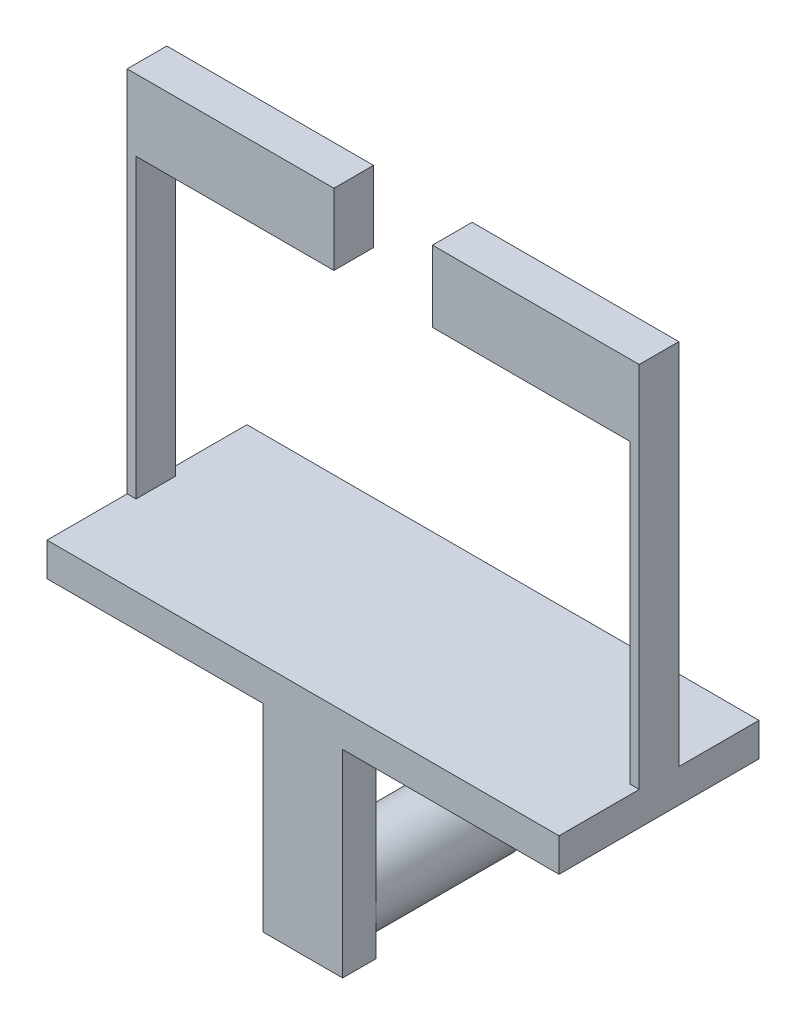
ISO-10303-21;
HEADER;
FILE_DESCRIPTION(('STEP AP214'),'2;1');
FILE_NAME('part.step','',(''),(''),'','','');
FILE_SCHEMA(('AUTOMOTIVE_DESIGN { 1 0 10303 214 1 1 1 1 }'));
ENDSEC;
DATA;
#1=APPLICATION_CONTEXT('core data for automotive mechanical design processes');
#2=APPLICATION_PROTOCOL_DEFINITION('international standard','automotive_design',2000,#1);
#3=PRODUCT_CONTEXT('',#1,'mechanical');
#4=PRODUCT('Part','Part','',(#3));
#5=PRODUCT_RELATED_PRODUCT_CATEGORY('part','',(#4));
#6=PRODUCT_DEFINITION_FORMATION('','',#4);
#7=PRODUCT_DEFINITION_CONTEXT('part definition',#1,'design');
#8=PRODUCT_DEFINITION('design','',#6,#7);
#9=PRODUCT_DEFINITION_SHAPE('','',#8);
#10=(LENGTH_UNIT() NAMED_UNIT(*) SI_UNIT(.MILLI.,.METRE.));
#11=(NAMED_UNIT(*) PLANE_ANGLE_UNIT() SI_UNIT($,.RADIAN.));
#12=(NAMED_UNIT(*) SI_UNIT($,.STERADIAN.) SOLID_ANGLE_UNIT());
#13=UNCERTAINTY_MEASURE_WITH_UNIT(LENGTH_MEASURE(1.E-05),#10,'distance_accuracy_value','');
#14=(GEOMETRIC_REPRESENTATION_CONTEXT(3) GLOBAL_UNCERTAINTY_ASSIGNED_CONTEXT((#13)) GLOBAL_UNIT_ASSIGNED_CONTEXT((#10,
#11,#12)) REPRESENTATION_CONTEXT('',''));
#15=CARTESIAN_POINT('',(0.,0.,0.));
#16=DIRECTION('',(0.,0.,1.));
#17=DIRECTION('',(1.,0.,0.));
#18=AXIS2_PLACEMENT_3D('',#15,#16,#17);
#19=CARTESIAN_POINT('',(0.,29.68752,0.));
#20=DIRECTION('',(0.,-1.,0.));
#21=DIRECTION('',(0.,0.,-1.));
#22=AXIS2_PLACEMENT_3D('',#19,#20,#21);
#23=PLANE('',#22);
#24=DIRECTION('',(1.,0.,0.));
#25=VECTOR('',#24,1.);
#26=CARTESIAN_POINT('',(-44.9980277605177,29.68752,-17.9190480402712));
#27=LINE('',#26,#25);
#28=CARTESIAN_POINT('',(-44.9980277605177,29.68752,-17.9190480402712));
#29=VERTEX_POINT('',#28);
#30=CARTESIAN_POINT('',(-43.8550277605177,29.68752,-17.9190480402712));
#31=VERTEX_POINT('',#30);
#32=EDGE_CURVE('E338',#29,#31,#27,.T.);
#33=ORIENTED_EDGE('',*,*,#32,.F.);
#34=DIRECTION('',(0.,0.,1.));
#35=VECTOR('',#34,1.);
#36=CARTESIAN_POINT('',(-44.9980277605177,29.68752,-7.63204804027117));
#37=LINE('',#36,#35);
#38=CARTESIAN_POINT('',(-44.9980277605177,29.68752,-7.63204804027117));
#39=VERTEX_POINT('',#38);
#40=EDGE_CURVE('E257',#29,#39,#37,.T.);
#41=ORIENTED_EDGE('',*,*,#40,.T.);
#42=DIRECTION('',(1.,0.,0.));
#43=VECTOR('',#42,1.);
#44=CARTESIAN_POINT('',(-44.9980277605177,29.68752,-7.63204804027117));
#45=LINE('',#44,#43);
#46=CARTESIAN_POINT('',(20.6965322394823,29.68752,-7.63204804027119));
#47=VERTEX_POINT('',#46);
#48=EDGE_CURVE('E400',#39,#47,#45,.T.);
#49=ORIENTED_EDGE('',*,*,#48,.T.);
#50=DIRECTION('',(0.,0.,-1.));
#51=VECTOR('',#50,1.);
#52=CARTESIAN_POINT('',(20.6965322394823,29.68752,-7.63204804027119));
#53=LINE('',#52,#51);
#54=CARTESIAN_POINT('',(20.6965322394823,29.68752,-17.9190480402712));
#55=VERTEX_POINT('',#54);
#56=EDGE_CURVE('E390',#47,#55,#53,.T.);
#57=ORIENTED_EDGE('',*,*,#56,.T.);
#58=DIRECTION('',(1.,0.,0.));
#59=VECTOR('',#58,1.);
#60=CARTESIAN_POINT('',(20.6965322394823,29.68752,-17.9190480402712));
#61=LINE('',#60,#59);
#62=CARTESIAN_POINT('',(19.5414560760783,29.68752,-17.9190480402712));
#63=VERTEX_POINT('',#62);
#64=EDGE_CURVE('E373',#63,#55,#61,.T.);
#65=ORIENTED_EDGE('',*,*,#64,.F.);
#66=DIRECTION('',(0.,0.,1.));
#67=VECTOR('',#66,1.);
#68=CARTESIAN_POINT('',(19.5414560760783,29.68752,-22.9990480402712));
#69=LINE('',#68,#67);
#70=CARTESIAN_POINT('',(19.5414560760783,29.68752,-22.9990480402712));
#71=VERTEX_POINT('',#70);
#72=EDGE_CURVE('E380',#71,#63,#69,.T.);
#73=ORIENTED_EDGE('',*,*,#72,.F.);
#74=DIRECTION('',(-1.,0.,0.));
#75=VECTOR('',#74,1.);
#76=CARTESIAN_POINT('',(20.6965322394823,29.68752,-22.9990480402712));
#77=LINE('',#76,#75);
#78=CARTESIAN_POINT('',(20.6965322394823,29.68752,-22.9990480402712));
#79=VERTEX_POINT('',#78);
#80=EDGE_CURVE('E341',#79,#71,#77,.T.);
#81=ORIENTED_EDGE('',*,*,#80,.F.);
#82=CARTESIAN_POINT('',(20.6965322394823,29.68752,-33.2860480402712));
#83=VERTEX_POINT('',#82);
#84=EDGE_CURVE('E391',#79,#83,#53,.T.);
#85=ORIENTED_EDGE('',*,*,#84,.T.);
#86=DIRECTION('',(-1.,0.,0.));
#87=VECTOR('',#86,1.);
#88=CARTESIAN_POINT('',(-44.9980277605177,29.68752,-33.2860480402712));
#89=LINE('',#88,#87);
#90=CARTESIAN_POINT('',(-44.9980277605177,29.68752,-33.2860480402712));
#91=VERTEX_POINT('',#90);
#92=EDGE_CURVE('E387',#83,#91,#89,.T.);
#93=ORIENTED_EDGE('',*,*,#92,.T.);
#94=CARTESIAN_POINT('',(-44.9980277605177,29.68752,-22.9990480402712));
#95=VERTEX_POINT('',#94);
#96=EDGE_CURVE('E393',#91,#95,#37,.T.);
#97=ORIENTED_EDGE('',*,*,#96,.T.);
#98=DIRECTION('',(-1.,0.,0.));
#99=VECTOR('',#98,1.);
#100=CARTESIAN_POINT('',(-44.9980277605177,29.68752,-22.9990480402712));
#101=LINE('',#100,#99);
#102=CARTESIAN_POINT('',(-43.8550277605177,29.68752,-22.9990480402712));
#103=VERTEX_POINT('',#102);
#104=EDGE_CURVE('E121',#103,#95,#101,.T.);
#105=ORIENTED_EDGE('',*,*,#104,.F.);
#106=DIRECTION('',(0.,0.,-1.));
#107=VECTOR('',#106,1.);
#108=CARTESIAN_POINT('',(-43.8550277605177,29.68752,-17.9190480402712));
#109=LINE('',#108,#107);
#110=EDGE_CURVE('E118',#31,#103,#109,.T.);
#111=ORIENTED_EDGE('',*,*,#110,.F.);
#112=EDGE_LOOP('',(#33,#41,#49,#57,#65,#73,#81,#85,#93,#97,#105,#111));
#113=FACE_BOUND('',#112,.T.);
#114=ADVANCED_FACE('F103',(#113),#23,.F.);
#115=CARTESIAN_POINT('',(-17.2688477605177,25.4,-11.9195680402712));
#116=DIRECTION('',(0.,0.,1.));
#117=DIRECTION('',(1.,0.,0.));
#118=AXIS2_PLACEMENT_3D('',#115,#116,#117);
#119=PLANE('',#118);
#120=DIRECTION('',(0.,-1.,0.));
#121=VECTOR('',#120,1.);
#122=CARTESIAN_POINT('',(-17.2688477605177,25.4,-11.9195680402712));
#123=LINE('',#122,#121);
#124=CARTESIAN_POINT('',(-17.2688477605177,5.098542,-11.9195680402712));
#125=VERTEX_POINT('',#124);
#126=CARTESIAN_POINT('',(-17.2688477605177,0.,-11.9195680402712));
#127=VERTEX_POINT('',#126);
#128=EDGE_CURVE('E466',#125,#127,#123,.T.);
#129=ORIENTED_EDGE('',*,*,#128,.F.);
#130=CARTESIAN_POINT('',(-12.1697977605177,5.098542,-11.9195680402712));
#131=DIRECTION('',(0.,0.,1.));
#132=DIRECTION('',(1.,0.,0.));
#133=AXIS2_PLACEMENT_3D('',#130,#131,#132);
#134=CIRCLE('',#133,5.09905);
#135=CARTESIAN_POINT('',(-12.241772594564,0.,-11.9195680402712));
#136=VERTEX_POINT('',#135);
#137=EDGE_CURVE('E12',#125,#136,#134,.T.);
#138=ORIENTED_EDGE('',*,*,#137,.T.);
#139=DIRECTION('',(-1.,0.,0.));
#140=VECTOR('',#139,1.);
#141=CARTESIAN_POINT('',(-17.2688477605177,0.,-11.9195680402712));
#142=LINE('',#141,#140);
#143=EDGE_CURVE('E102',#136,#127,#142,.T.);
#144=ORIENTED_EDGE('',*,*,#143,.T.);
#145=EDGE_LOOP('',(#129,#138,#144));
#146=FACE_BOUND('',#145,.T.);
#147=ADVANCED_FACE('F538',(#146),#119,.F.);
#148=DIRECTION('',(0.,-1.,0.));
#149=VECTOR('',#148,1.);
#150=CARTESIAN_POINT('',(-7.0707477605177,25.4,-11.9195680402712));
#151=LINE('',#150,#149);
#152=CARTESIAN_POINT('',(-7.0707477605177,25.4,-11.9195680402712));
#153=VERTEX_POINT('',#152);
#154=CARTESIAN_POINT('',(-7.0707477605177,5.098542,-11.9195680402712));
#155=VERTEX_POINT('',#154);
#156=EDGE_CURVE('E469',#153,#155,#151,.T.);
#157=ORIENTED_EDGE('',*,*,#156,.T.);
#158=EDGE_CURVE('E427',#155,#125,#134,.T.);
#159=ORIENTED_EDGE('',*,*,#158,.T.);
#160=CARTESIAN_POINT('',(-17.2688477605177,25.4,-11.9195680402712));
#161=VERTEX_POINT('',#160);
#162=EDGE_CURVE('E465',#161,#125,#123,.T.);
#163=ORIENTED_EDGE('',*,*,#162,.F.);
#164=DIRECTION('',(-1.,0.,0.));
#165=VECTOR('',#164,1.);
#166=CARTESIAN_POINT('',(-17.2688477605177,25.4,-11.9195680402712));
#167=LINE('',#166,#165);
#168=EDGE_CURVE('E506',#153,#161,#167,.T.);
#169=ORIENTED_EDGE('',*,*,#168,.F.);
#170=EDGE_LOOP('',(#157,#159,#163,#169));
#171=FACE_BOUND('',#170,.T.);
#172=ADVANCED_FACE('F540',(#171),#119,.F.);
#173=CARTESIAN_POINT('',(-17.2688477605177,25.4,-11.9195680402712));
#174=DIRECTION('',(1.,0.,0.));
#175=DIRECTION('',(0.,0.,-1.));
#176=AXIS2_PLACEMENT_3D('',#173,#174,#175);
#177=PLANE('',#176);
#178=DIRECTION('',(0.,0.,1.));
#179=VECTOR('',#178,1.);
#180=CARTESIAN_POINT('',(-17.2688477605177,0.,-11.9195680402712));
#181=LINE('',#180,#179);
#182=CARTESIAN_POINT('',(-17.2688477605177,0.,-7.63204804027118));
#183=VERTEX_POINT('',#182);
#184=EDGE_CURVE('E434',#127,#183,#181,.T.);
#185=ORIENTED_EDGE('',*,*,#184,.T.);
#186=DIRECTION('',(0.,-1.,0.));
#187=VECTOR('',#186,1.);
#188=CARTESIAN_POINT('',(-17.2688477605177,25.4,-7.63204804027118));
#189=LINE('',#188,#187);
#190=CARTESIAN_POINT('',(-17.2688477605177,25.4,-7.63204804027118));
#191=VERTEX_POINT('',#190);
#192=EDGE_CURVE('E450',#191,#183,#189,.T.);
#193=ORIENTED_EDGE('',*,*,#192,.F.);
#194=DIRECTION('',(0.,0.,1.));
#195=VECTOR('',#194,1.);
#196=CARTESIAN_POINT('',(-17.2688477605177,25.4,-11.9195680402712));
#197=LINE('',#196,#195);
#198=EDGE_CURVE('E452',#161,#191,#197,.T.);
#199=ORIENTED_EDGE('',*,*,#198,.F.);
#200=ORIENTED_EDGE('',*,*,#162,.T.);
#201=ORIENTED_EDGE('',*,*,#128,.T.);
#202=EDGE_LOOP('',(#185,#193,#199,#200,#201));
#203=FACE_BOUND('',#202,.T.);
#204=ADVANCED_FACE('F101',(#203),#177,.F.);
#205=CARTESIAN_POINT('',(-17.2688477605177,25.4,-7.63204804027118));
#206=DIRECTION('',(0.,0.,-1.));
#207=DIRECTION('',(-1.,0.,0.));
#208=AXIS2_PLACEMENT_3D('',#205,#206,#207);
#209=PLANE('',#208);
#210=DIRECTION('',(1.,0.,0.));
#211=VECTOR('',#210,1.);
#212=CARTESIAN_POINT('',(-17.2688477605177,0.,-7.63204804027118));
#213=LINE('',#212,#211);
#214=CARTESIAN_POINT('',(-7.0707477605177,0.,-7.63204804027118));
#215=VERTEX_POINT('',#214);
#216=EDGE_CURVE('E498',#183,#215,#213,.T.);
#217=ORIENTED_EDGE('',*,*,#216,.T.);
#218=DIRECTION('',(0.,-1.,0.));
#219=VECTOR('',#218,1.);
#220=CARTESIAN_POINT('',(-7.0707477605177,25.4,-7.63204804027118));
#221=LINE('',#220,#219);
#222=CARTESIAN_POINT('',(-7.0707477605177,25.4,-7.63204804027118));
#223=VERTEX_POINT('',#222);
#224=EDGE_CURVE('E471',#223,#215,#221,.T.);
#225=ORIENTED_EDGE('',*,*,#224,.F.);
#226=DIRECTION('',(1.,0.,0.));
#227=VECTOR('',#226,1.);
#228=CARTESIAN_POINT('',(-44.9980277605177,25.4,-7.63204804027117));
#229=LINE('',#228,#227);
#230=CARTESIAN_POINT('',(20.6965322394823,25.4,-7.63204804027119));
#231=VERTEX_POINT('',#230);
#232=EDGE_CURVE('E407',#223,#231,#229,.T.);
#233=ORIENTED_EDGE('',*,*,#232,.T.);
#234=DIRECTION('',(0.,-1.,0.));
#235=VECTOR('',#234,1.);
#236=CARTESIAN_POINT('',(20.6965322394823,29.68752,-7.63204804027119));
#237=LINE('',#236,#235);
#238=EDGE_CURVE('E399',#47,#231,#237,.T.);
#239=ORIENTED_EDGE('',*,*,#238,.F.);
#240=ORIENTED_EDGE('',*,*,#48,.F.);
#241=DIRECTION('',(0.,-1.,0.));
#242=VECTOR('',#241,1.);
#243=CARTESIAN_POINT('',(-44.9980277605177,29.68752,-7.63204804027117));
#244=LINE('',#243,#242);
#245=CARTESIAN_POINT('',(-44.9980277605177,25.4,-7.63204804027117));
#246=VERTEX_POINT('',#245);
#247=EDGE_CURVE('E417',#39,#246,#244,.T.);
#248=ORIENTED_EDGE('',*,*,#247,.T.);
#249=EDGE_CURVE('E411',#246,#191,#229,.T.);
#250=ORIENTED_EDGE('',*,*,#249,.T.);
#251=ORIENTED_EDGE('',*,*,#192,.T.);
#252=EDGE_LOOP('',(#217,#225,#233,#239,#240,#248,#250,#251));
#253=FACE_BOUND('',#252,.T.);
#254=ADVANCED_FACE('F539',(#253),#209,.F.);
#255=CARTESIAN_POINT('',(-7.0707477605177,25.4,-11.9195680402712));
#256=DIRECTION('',(-1.,0.,0.));
#257=DIRECTION('',(0.,0.,1.));
#258=AXIS2_PLACEMENT_3D('',#255,#256,#257);
#259=PLANE('',#258);
#260=DIRECTION('',(0.,0.,-1.));
#261=VECTOR('',#260,1.);
#262=CARTESIAN_POINT('',(-7.0707477605177,0.,-11.9195680402712));
#263=LINE('',#262,#261);
#264=CARTESIAN_POINT('',(-7.0707477605177,0.,-11.9195680402712));
#265=VERTEX_POINT('',#264);
#266=EDGE_CURVE('E460',#215,#265,#263,.T.);
#267=ORIENTED_EDGE('',*,*,#266,.T.);
#268=EDGE_CURVE('E470',#155,#265,#151,.T.);
#269=ORIENTED_EDGE('',*,*,#268,.F.);
#270=ORIENTED_EDGE('',*,*,#156,.F.);
#271=DIRECTION('',(0.,0.,-1.));
#272=VECTOR('',#271,1.);
#273=CARTESIAN_POINT('',(-7.0707477605177,25.4,-11.9195680402712));
#274=LINE('',#273,#272);
#275=EDGE_CURVE('E509',#223,#153,#274,.T.);
#276=ORIENTED_EDGE('',*,*,#275,.F.);
#277=ORIENTED_EDGE('',*,*,#224,.T.);
#278=EDGE_LOOP('',(#267,#269,#270,#276,#277));
#279=FACE_BOUND('',#278,.T.);
#280=ADVANCED_FACE('F492',(#279),#259,.F.);
#281=CARTESIAN_POINT('',(-12.0978229264714,0.,-11.9195680402712));
#282=VERTEX_POINT('',#281);
#283=EDGE_CURVE('E455',#265,#282,#142,.T.);
#284=ORIENTED_EDGE('',*,*,#283,.T.);
#285=EDGE_CURVE('E115',#282,#155,#134,.T.);
#286=ORIENTED_EDGE('',*,*,#285,.T.);
#287=ORIENTED_EDGE('',*,*,#268,.T.);
#288=EDGE_LOOP('',(#284,#286,#287));
#289=FACE_BOUND('',#288,.T.);
#290=ADVANCED_FACE('F489',(#289),#119,.F.);
#291=CARTESIAN_POINT('',(0.,0.,0.));
#292=DIRECTION('',(0.,1.,0.));
#293=DIRECTION('',(0.,0.,1.));
#294=AXIS2_PLACEMENT_3D('',#291,#292,#293);
#295=PLANE('',#294);
#296=ORIENTED_EDGE('',*,*,#184,.F.);
#297=ORIENTED_EDGE('',*,*,#143,.F.);
#298=CARTESIAN_POINT('',(-12.1697977605177,5.098542,-11.9195680402712));
#299=DIRECTION('',(0.,0.,-1.));
#300=DIRECTION('',(0.0141153418864927,-0.999900373599004,0.));
#301=AXIS2_PLACEMENT_3D('',#298,#299,#300);
#302=CIRCLE('',#301,5.09905);
#303=EDGE_CURVE('E456',#282,#136,#302,.T.);
#304=ORIENTED_EDGE('',*,*,#303,.F.);
#305=ORIENTED_EDGE('',*,*,#283,.F.);
#306=ORIENTED_EDGE('',*,*,#266,.F.);
#307=ORIENTED_EDGE('',*,*,#216,.F.);
#308=EDGE_LOOP('',(#296,#297,#304,#305,#306,#307));
#309=FACE_BOUND('',#308,.T.);
#310=ADVANCED_FACE('F483',(#309),#295,.F.);
#311=CARTESIAN_POINT('',(-12.1697977605177,5.098542,-30.9695680402712));
#312=DIRECTION('',(0.,0.,1.));
#313=DIRECTION('',(1.,0.,0.));
#314=AXIS2_PLACEMENT_3D('',#311,#312,#313);
#315=CYLINDRICAL_SURFACE('',#314,5.09905);
#316=CARTESIAN_POINT('',(-12.1697977605177,5.098542,-30.9695680402712));
#317=DIRECTION('',(0.,0.,1.));
#318=DIRECTION('',(1.,0.,0.));
#319=AXIS2_PLACEMENT_3D('',#316,#317,#318);
#320=CIRCLE('',#319,5.09905);
#321=CARTESIAN_POINT('',(-7.0707477605177,5.098542,-30.9695680402712));
#322=VERTEX_POINT('',#321);
#323=EDGE_CURVE('E431',#322,#322,#320,.T.);
#324=ORIENTED_EDGE('',*,*,#323,.T.);
#325=EDGE_LOOP('',(#324));
#326=FACE_BOUND('',#325,.T.);
#327=ORIENTED_EDGE('',*,*,#158,.F.);
#328=ORIENTED_EDGE('',*,*,#285,.F.);
#329=ORIENTED_EDGE('',*,*,#303,.T.);
#330=ORIENTED_EDGE('',*,*,#137,.F.);
#331=EDGE_LOOP('',(#327,#328,#329,#330));
#332=FACE_BOUND('',#331,.T.);
#333=ADVANCED_FACE('F519',(#326,#332),#315,.T.);
#334=CARTESIAN_POINT('',(-12.1697977605177,5.098542,-30.9695680402712));
#335=DIRECTION('',(0.,0.,1.));
#336=DIRECTION('',(1.,0.,0.));
#337=AXIS2_PLACEMENT_3D('',#334,#335,#336);
#338=PLANE('',#337);
#339=ORIENTED_EDGE('',*,*,#323,.F.);
#340=EDGE_LOOP('',(#339));
#341=FACE_BOUND('',#340,.T.);
#342=ADVANCED_FACE('F527',(#341),#338,.F.);
#343=CARTESIAN_POINT('',(20.6965322394823,29.68752,-7.63204804027119));
#344=DIRECTION('',(-1.,0.,0.));
#345=DIRECTION('',(0.,0.,1.));
#346=AXIS2_PLACEMENT_3D('',#343,#344,#345);
#347=PLANE('',#346);
#348=DIRECTION('',(0.,0.,-1.));
#349=VECTOR('',#348,1.);
#350=CARTESIAN_POINT('',(20.6965322394823,25.4,-7.63204804027119));
#351=LINE('',#350,#349);
#352=CARTESIAN_POINT('',(20.6965322394823,25.4,-33.2860480402712));
#353=VERTEX_POINT('',#352);
#354=EDGE_CURVE('E358',#231,#353,#351,.T.);
#355=ORIENTED_EDGE('',*,*,#354,.T.);
#356=DIRECTION('',(0.,-1.,0.));
#357=VECTOR('',#356,1.);
#358=CARTESIAN_POINT('',(20.6965322394823,29.68752,-33.2860480402712));
#359=LINE('',#358,#357);
#360=EDGE_CURVE('E428',#83,#353,#359,.T.);
#361=ORIENTED_EDGE('',*,*,#360,.F.);
#362=ORIENTED_EDGE('',*,*,#84,.F.);
#363=DIRECTION('',(0.,-1.,0.));
#364=VECTOR('',#363,1.);
#365=CARTESIAN_POINT('',(20.6965322394823,67.76212,-22.9990480402712));
#366=LINE('',#365,#364);
#367=CARTESIAN_POINT('',(20.6965322394823,76.90612,-22.9990480402712));
#368=VERTEX_POINT('',#367);
#369=EDGE_CURVE('E302',#368,#79,#366,.T.);
#370=ORIENTED_EDGE('',*,*,#369,.F.);
#371=DIRECTION('',(0.,0.,-1.));
#372=VECTOR('',#371,1.);
#373=CARTESIAN_POINT('',(20.6965322394823,76.90612,-17.9190480402712));
#374=LINE('',#373,#372);
#375=CARTESIAN_POINT('',(20.6965322394823,76.90612,-17.9190480402712));
#376=VERTEX_POINT('',#375);
#377=EDGE_CURVE('E316',#376,#368,#374,.T.);
#378=ORIENTED_EDGE('',*,*,#377,.F.);
#379=DIRECTION('',(0.,-1.,0.));
#380=VECTOR('',#379,1.);
#381=CARTESIAN_POINT('',(20.6965322394823,67.76212,-17.9190480402712));
#382=LINE('',#381,#380);
#383=EDGE_CURVE('E368',#376,#55,#382,.T.);
#384=ORIENTED_EDGE('',*,*,#383,.T.);
#385=ORIENTED_EDGE('',*,*,#56,.F.);
#386=ORIENTED_EDGE('',*,*,#238,.T.);
#387=EDGE_LOOP('',(#355,#361,#362,#370,#378,#384,#385,#386));
#388=FACE_BOUND('',#387,.T.);
#389=ADVANCED_FACE('F566',(#388),#347,.F.);
#390=CARTESIAN_POINT('',(-44.9980277605177,29.68752,-33.2860480402712));
#391=DIRECTION('',(0.,0.,1.));
#392=DIRECTION('',(1.,0.,0.));
#393=AXIS2_PLACEMENT_3D('',#390,#391,#392);
#394=PLANE('',#393);
#395=DIRECTION('',(-1.,0.,0.));
#396=VECTOR('',#395,1.);
#397=CARTESIAN_POINT('',(-44.9980277605177,25.4,-33.2860480402712));
#398=LINE('',#397,#396);
#399=CARTESIAN_POINT('',(-44.9980277605177,25.4,-33.2860480402712));
#400=VERTEX_POINT('',#399);
#401=EDGE_CURVE('E404',#353,#400,#398,.T.);
#402=ORIENTED_EDGE('',*,*,#401,.T.);
#403=DIRECTION('',(0.,-1.,0.));
#404=VECTOR('',#403,1.);
#405=CARTESIAN_POINT('',(-44.9980277605177,29.68752,-33.2860480402712));
#406=LINE('',#405,#404);
#407=EDGE_CURVE('E422',#91,#400,#406,.T.);
#408=ORIENTED_EDGE('',*,*,#407,.F.);
#409=ORIENTED_EDGE('',*,*,#92,.F.);
#410=ORIENTED_EDGE('',*,*,#360,.T.);
#411=EDGE_LOOP('',(#402,#408,#409,#410));
#412=FACE_BOUND('',#411,.T.);
#413=ADVANCED_FACE('F562',(#412),#394,.F.);
#414=CARTESIAN_POINT('',(-44.9980277605177,29.68752,-7.63204804027117));
#415=DIRECTION('',(1.,0.,0.));
#416=DIRECTION('',(0.,0.,-1.));
#417=AXIS2_PLACEMENT_3D('',#414,#415,#416);
#418=PLANE('',#417);
#419=DIRECTION('',(0.,0.,1.));
#420=VECTOR('',#419,1.);
#421=CARTESIAN_POINT('',(-44.9980277605177,25.4,-7.63204804027117));
#422=LINE('',#421,#420);
#423=EDGE_CURVE('E410',#400,#246,#422,.T.);
#424=ORIENTED_EDGE('',*,*,#423,.T.);
#425=ORIENTED_EDGE('',*,*,#247,.F.);
#426=ORIENTED_EDGE('',*,*,#40,.F.);
#427=DIRECTION('',(0.,-1.,0.));
#428=VECTOR('',#427,1.);
#429=CARTESIAN_POINT('',(-44.9980277605177,67.76212,-17.9190480402712));
#430=LINE('',#429,#428);
#431=CARTESIAN_POINT('',(-44.9980277605177,76.90612,-17.9190480402712));
#432=VERTEX_POINT('',#431);
#433=EDGE_CURVE('E254',#432,#29,#430,.T.);
#434=ORIENTED_EDGE('',*,*,#433,.F.);
#435=DIRECTION('',(0.,0.,1.));
#436=VECTOR('',#435,1.);
#437=CARTESIAN_POINT('',(-44.9980277605177,76.90612,-22.9990480402712));
#438=LINE('',#437,#436);
#439=CARTESIAN_POINT('',(-44.9980277605177,76.90612,-22.9990480402712));
#440=VERTEX_POINT('',#439);
#441=EDGE_CURVE('E256',#440,#432,#438,.T.);
#442=ORIENTED_EDGE('',*,*,#441,.F.);
#443=DIRECTION('',(0.,-1.,0.));
#444=VECTOR('',#443,1.);
#445=CARTESIAN_POINT('',(-44.9980277605177,67.76212,-22.9990480402712));
#446=LINE('',#445,#444);
#447=EDGE_CURVE('E264',#440,#95,#446,.T.);
#448=ORIENTED_EDGE('',*,*,#447,.T.);
#449=ORIENTED_EDGE('',*,*,#96,.F.);
#450=ORIENTED_EDGE('',*,*,#407,.T.);
#451=EDGE_LOOP('',(#424,#425,#426,#434,#442,#448,#449,#450));
#452=FACE_BOUND('',#451,.T.);
#453=ADVANCED_FACE('F253',(#452),#418,.F.);
#454=CARTESIAN_POINT('',(0.,25.4,0.));
#455=DIRECTION('',(0.,-1.,0.));
#456=DIRECTION('',(0.,0.,-1.));
#457=AXIS2_PLACEMENT_3D('',#454,#455,#456);
#458=PLANE('',#457);
#459=ORIENTED_EDGE('',*,*,#168,.T.);
#460=ORIENTED_EDGE('',*,*,#198,.T.);
#461=ORIENTED_EDGE('',*,*,#249,.F.);
#462=ORIENTED_EDGE('',*,*,#423,.F.);
#463=ORIENTED_EDGE('',*,*,#401,.F.);
#464=ORIENTED_EDGE('',*,*,#354,.F.);
#465=ORIENTED_EDGE('',*,*,#232,.F.);
#466=ORIENTED_EDGE('',*,*,#275,.T.);
#467=EDGE_LOOP('',(#459,#460,#461,#462,#463,#464,#465,#466));
#468=FACE_BOUND('',#467,.T.);
#469=ADVANCED_FACE('F560',(#468),#458,.T.);
#470=CARTESIAN_POINT('',(20.6965322394823,67.76212,-22.9990480402712));
#471=DIRECTION('',(0.,0.,1.));
#472=DIRECTION('',(1.,0.,0.));
#473=AXIS2_PLACEMENT_3D('',#470,#471,#472);
#474=PLANE('',#473);
#475=ORIENTED_EDGE('',*,*,#80,.T.);
#476=DIRECTION('',(0.,-1.,0.));
#477=VECTOR('',#476,1.);
#478=CARTESIAN_POINT('',(19.5414560760783,67.76212,-22.9990480402712));
#479=LINE('',#478,#477);
#480=CARTESIAN_POINT('',(19.5414560760783,67.76212,-22.9990480402712));
#481=VERTEX_POINT('',#480);
#482=EDGE_CURVE('E359',#481,#71,#479,.T.);
#483=ORIENTED_EDGE('',*,*,#482,.F.);
#484=DIRECTION('',(-1.,0.,0.));
#485=VECTOR('',#484,1.);
#486=CARTESIAN_POINT('',(20.6965322394823,67.76212,-22.9990480402712));
#487=LINE('',#486,#485);
#488=CARTESIAN_POINT('',(-5.8261477605177,67.76212,-22.9990480402712));
#489=VERTEX_POINT('',#488);
#490=EDGE_CURVE('E298',#481,#489,#487,.T.);
#491=ORIENTED_EDGE('',*,*,#490,.T.);
#492=DIRECTION('',(0.,-1.,0.));
#493=VECTOR('',#492,1.);
#494=CARTESIAN_POINT('',(-5.8261477605177,76.90612,-22.9990480402712));
#495=LINE('',#494,#493);
#496=CARTESIAN_POINT('',(-5.8261477605177,76.90612,-22.9990480402712));
#497=VERTEX_POINT('',#496);
#498=EDGE_CURVE('E304',#497,#489,#495,.T.);
#499=ORIENTED_EDGE('',*,*,#498,.F.);
#500=DIRECTION('',(-1.,0.,0.));
#501=VECTOR('',#500,1.);
#502=CARTESIAN_POINT('',(20.6965322394823,76.90612,-22.9990480402712));
#503=LINE('',#502,#501);
#504=EDGE_CURVE('E330',#368,#497,#503,.T.);
#505=ORIENTED_EDGE('',*,*,#504,.F.);
#506=ORIENTED_EDGE('',*,*,#369,.T.);
#507=EDGE_LOOP('',(#475,#483,#491,#499,#505,#506));
#508=FACE_BOUND('',#507,.T.);
#509=ADVANCED_FACE('F557',(#508),#474,.F.);
#510=CARTESIAN_POINT('',(19.5414560760783,67.76212,-22.9990480402712));
#511=DIRECTION('',(1.,0.,0.));
#512=DIRECTION('',(0.,0.,-1.));
#513=AXIS2_PLACEMENT_3D('',#510,#511,#512);
#514=PLANE('',#513);
#515=ORIENTED_EDGE('',*,*,#72,.T.);
#516=DIRECTION('',(0.,-1.,0.));
#517=VECTOR('',#516,1.);
#518=CARTESIAN_POINT('',(19.5414560760783,67.76212,-17.9190480402712));
#519=LINE('',#518,#517);
#520=CARTESIAN_POINT('',(19.5414560760783,67.76212,-17.9190480402712));
#521=VERTEX_POINT('',#520);
#522=EDGE_CURVE('E364',#521,#63,#519,.T.);
#523=ORIENTED_EDGE('',*,*,#522,.F.);
#524=DIRECTION('',(0.,0.,1.));
#525=VECTOR('',#524,1.);
#526=CARTESIAN_POINT('',(19.5414560760783,67.76212,-22.9990480402712));
#527=LINE('',#526,#525);
#528=EDGE_CURVE('E375',#481,#521,#527,.T.);
#529=ORIENTED_EDGE('',*,*,#528,.F.);
#530=ORIENTED_EDGE('',*,*,#482,.T.);
#531=EDGE_LOOP('',(#515,#523,#529,#530));
#532=FACE_BOUND('',#531,.T.);
#533=ADVANCED_FACE('F618',(#532),#514,.F.);
#534=CARTESIAN_POINT('',(20.6965322394823,67.76212,-17.9190480402712));
#535=DIRECTION('',(0.,0.,-1.));
#536=DIRECTION('',(-1.,0.,0.));
#537=AXIS2_PLACEMENT_3D('',#534,#535,#536);
#538=PLANE('',#537);
#539=ORIENTED_EDGE('',*,*,#64,.T.);
#540=ORIENTED_EDGE('',*,*,#383,.F.);
#541=DIRECTION('',(1.,0.,0.));
#542=VECTOR('',#541,1.);
#543=CARTESIAN_POINT('',(20.6965322394823,76.90612,-17.9190480402712));
#544=LINE('',#543,#542);
#545=CARTESIAN_POINT('',(-5.8261477605177,76.90612,-17.9190480402712));
#546=VERTEX_POINT('',#545);
#547=EDGE_CURVE('E312',#546,#376,#544,.T.);
#548=ORIENTED_EDGE('',*,*,#547,.F.);
#549=DIRECTION('',(0.,-1.,0.));
#550=VECTOR('',#549,1.);
#551=CARTESIAN_POINT('',(-5.8261477605177,76.90612,-17.9190480402712));
#552=LINE('',#551,#550);
#553=CARTESIAN_POINT('',(-5.8261477605177,67.76212,-17.9190480402712));
#554=VERTEX_POINT('',#553);
#555=EDGE_CURVE('E307',#546,#554,#552,.T.);
#556=ORIENTED_EDGE('',*,*,#555,.T.);
#557=DIRECTION('',(1.,0.,0.));
#558=VECTOR('',#557,1.);
#559=CARTESIAN_POINT('',(20.6965322394823,67.76212,-17.9190480402712));
#560=LINE('',#559,#558);
#561=EDGE_CURVE('E313',#554,#521,#560,.T.);
#562=ORIENTED_EDGE('',*,*,#561,.T.);
#563=ORIENTED_EDGE('',*,*,#522,.T.);
#564=EDGE_LOOP('',(#539,#540,#548,#556,#562,#563));
#565=FACE_BOUND('',#564,.T.);
#566=ADVANCED_FACE('F554',(#565),#538,.F.);
#567=CARTESIAN_POINT('',(-43.8550277605177,67.76212,-17.9190480402712));
#568=DIRECTION('',(-1.,0.,0.));
#569=DIRECTION('',(0.,0.,1.));
#570=AXIS2_PLACEMENT_3D('',#567,#568,#569);
#571=PLANE('',#570);
#572=ORIENTED_EDGE('',*,*,#110,.T.);
#573=DIRECTION('',(0.,-1.,0.));
#574=VECTOR('',#573,1.);
#575=CARTESIAN_POINT('',(-43.8550277605177,67.76212,-22.9990480402712));
#576=LINE('',#575,#574);
#577=CARTESIAN_POINT('',(-43.8550277605177,67.76212,-22.9990480402712));
#578=VERTEX_POINT('',#577);
#579=EDGE_CURVE('E352',#578,#103,#576,.T.);
#580=ORIENTED_EDGE('',*,*,#579,.F.);
#581=DIRECTION('',(0.,0.,-1.));
#582=VECTOR('',#581,1.);
#583=CARTESIAN_POINT('',(-43.8550277605177,67.76212,-17.9190480402712));
#584=LINE('',#583,#582);
#585=CARTESIAN_POINT('',(-43.8550277605177,67.76212,-17.9190480402712));
#586=VERTEX_POINT('',#585);
#587=EDGE_CURVE('E337',#586,#578,#584,.T.);
#588=ORIENTED_EDGE('',*,*,#587,.F.);
#589=DIRECTION('',(0.,-1.,0.));
#590=VECTOR('',#589,1.);
#591=CARTESIAN_POINT('',(-43.8550277605177,67.76212,-17.9190480402712));
#592=LINE('',#591,#590);
#593=EDGE_CURVE('E263',#586,#31,#592,.T.);
#594=ORIENTED_EDGE('',*,*,#593,.T.);
#595=EDGE_LOOP('',(#572,#580,#588,#594));
#596=FACE_BOUND('',#595,.T.);
#597=ADVANCED_FACE('F597',(#596),#571,.F.);
#598=CARTESIAN_POINT('',(-44.9980277605177,67.76212,-22.9990480402712));
#599=DIRECTION('',(0.,0.,1.));
#600=DIRECTION('',(1.,0.,0.));
#601=AXIS2_PLACEMENT_3D('',#598,#599,#600);
#602=PLANE('',#601);
#603=ORIENTED_EDGE('',*,*,#104,.T.);
#604=ORIENTED_EDGE('',*,*,#447,.F.);
#605=DIRECTION('',(-1.,0.,0.));
#606=VECTOR('',#605,1.);
#607=CARTESIAN_POINT('',(-44.9980277605177,76.90612,-22.9990480402712));
#608=LINE('',#607,#606);
#609=CARTESIAN_POINT('',(-18.4753477605177,76.90612,-22.9990480402712));
#610=VERTEX_POINT('',#609);
#611=EDGE_CURVE('E279',#610,#440,#608,.T.);
#612=ORIENTED_EDGE('',*,*,#611,.F.);
#613=DIRECTION('',(0.,-1.,0.));
#614=VECTOR('',#613,1.);
#615=CARTESIAN_POINT('',(-18.4753477605177,76.90612,-22.9990480402712));
#616=LINE('',#615,#614);
#617=CARTESIAN_POINT('',(-18.4753477605177,67.76212,-22.9990480402712));
#618=VERTEX_POINT('',#617);
#619=EDGE_CURVE('E292',#610,#618,#616,.T.);
#620=ORIENTED_EDGE('',*,*,#619,.T.);
#621=DIRECTION('',(-1.,0.,0.));
#622=VECTOR('',#621,1.);
#623=CARTESIAN_POINT('',(-44.9980277605177,67.76212,-22.9990480402712));
#624=LINE('',#623,#622);
#625=EDGE_CURVE('E281',#618,#578,#624,.T.);
#626=ORIENTED_EDGE('',*,*,#625,.T.);
#627=ORIENTED_EDGE('',*,*,#579,.T.);
#628=EDGE_LOOP('',(#603,#604,#612,#620,#626,#627));
#629=FACE_BOUND('',#628,.T.);
#630=ADVANCED_FACE('F595',(#629),#602,.F.);
#631=CARTESIAN_POINT('',(-44.9980277605177,67.76212,-17.9190480402712));
#632=DIRECTION('',(0.,0.,-1.));
#633=DIRECTION('',(-1.,0.,0.));
#634=AXIS2_PLACEMENT_3D('',#631,#632,#633);
#635=PLANE('',#634);
#636=ORIENTED_EDGE('',*,*,#32,.T.);
#637=ORIENTED_EDGE('',*,*,#593,.F.);
#638=DIRECTION('',(1.,0.,0.));
#639=VECTOR('',#638,1.);
#640=CARTESIAN_POINT('',(-44.9980277605177,67.76212,-17.9190480402712));
#641=LINE('',#640,#639);
#642=CARTESIAN_POINT('',(-18.4753477605177,67.76212,-17.9190480402712));
#643=VERTEX_POINT('',#642);
#644=EDGE_CURVE('E291',#586,#643,#641,.T.);
#645=ORIENTED_EDGE('',*,*,#644,.T.);
#646=DIRECTION('',(0.,-1.,0.));
#647=VECTOR('',#646,1.);
#648=CARTESIAN_POINT('',(-18.4753477605177,76.90612,-17.9190480402712));
#649=LINE('',#648,#647);
#650=CARTESIAN_POINT('',(-18.4753477605177,76.90612,-17.9190480402712));
#651=VERTEX_POINT('',#650);
#652=EDGE_CURVE('E269',#651,#643,#649,.T.);
#653=ORIENTED_EDGE('',*,*,#652,.F.);
#654=DIRECTION('',(1.,0.,0.));
#655=VECTOR('',#654,1.);
#656=CARTESIAN_POINT('',(-44.9980277605177,76.90612,-17.9190480402712));
#657=LINE('',#656,#655);
#658=EDGE_CURVE('E270',#432,#651,#657,.T.);
#659=ORIENTED_EDGE('',*,*,#658,.F.);
#660=ORIENTED_EDGE('',*,*,#433,.T.);
#661=EDGE_LOOP('',(#636,#637,#645,#653,#659,#660));
#662=FACE_BOUND('',#661,.T.);
#663=ADVANCED_FACE('F267',(#662),#635,.F.);
#664=CARTESIAN_POINT('',(0.,67.76212,0.));
#665=DIRECTION('',(0.,1.,0.));
#666=DIRECTION('',(0.,0.,1.));
#667=AXIS2_PLACEMENT_3D('',#664,#665,#666);
#668=PLANE('',#667);
#669=ORIENTED_EDGE('',*,*,#644,.F.);
#670=ORIENTED_EDGE('',*,*,#587,.T.);
#671=ORIENTED_EDGE('',*,*,#625,.F.);
#672=DIRECTION('',(0.,0.,-1.));
#673=VECTOR('',#672,1.);
#674=CARTESIAN_POINT('',(-18.4753477605177,67.76212,-22.9990480402712));
#675=LINE('',#674,#673);
#676=EDGE_CURVE('E285',#643,#618,#675,.T.);
#677=ORIENTED_EDGE('',*,*,#676,.F.);
#678=EDGE_LOOP('',(#669,#670,#671,#677));
#679=FACE_BOUND('',#678,.T.);
#680=ADVANCED_FACE('F633',(#679),#668,.F.);
#681=CARTESIAN_POINT('',(-18.4753477605177,76.90612,-22.9990480402712));
#682=DIRECTION('',(-1.,0.,0.));
#683=DIRECTION('',(0.,0.,1.));
#684=AXIS2_PLACEMENT_3D('',#681,#682,#683);
#685=PLANE('',#684);
#686=ORIENTED_EDGE('',*,*,#676,.T.);
#687=ORIENTED_EDGE('',*,*,#619,.F.);
#688=DIRECTION('',(0.,0.,-1.));
#689=VECTOR('',#688,1.);
#690=CARTESIAN_POINT('',(-18.4753477605177,76.90612,-22.9990480402712));
#691=LINE('',#690,#689);
#692=EDGE_CURVE('E274',#651,#610,#691,.T.);
#693=ORIENTED_EDGE('',*,*,#692,.F.);
#694=ORIENTED_EDGE('',*,*,#652,.T.);
#695=EDGE_LOOP('',(#686,#687,#693,#694));
#696=FACE_BOUND('',#695,.T.);
#697=ADVANCED_FACE('F628',(#696),#685,.F.);
#698=CARTESIAN_POINT('',(0.,76.90612,0.));
#699=DIRECTION('',(0.,1.,0.));
#700=DIRECTION('',(0.,0.,1.));
#701=AXIS2_PLACEMENT_3D('',#698,#699,#700);
#702=PLANE('',#701);
#703=ORIENTED_EDGE('',*,*,#441,.T.);
#704=ORIENTED_EDGE('',*,*,#658,.T.);
#705=ORIENTED_EDGE('',*,*,#692,.T.);
#706=ORIENTED_EDGE('',*,*,#611,.T.);
#707=EDGE_LOOP('',(#703,#704,#705,#706));
#708=FACE_BOUND('',#707,.T.);
#709=ADVANCED_FACE('F280',(#708),#702,.T.);
#710=CARTESIAN_POINT('',(0.,67.76212,0.));
#711=DIRECTION('',(0.,1.,0.));
#712=DIRECTION('',(0.,0.,1.));
#713=AXIS2_PLACEMENT_3D('',#710,#711,#712);
#714=PLANE('',#713);
#715=ORIENTED_EDGE('',*,*,#490,.F.);
#716=ORIENTED_EDGE('',*,*,#528,.T.);
#717=ORIENTED_EDGE('',*,*,#561,.F.);
#718=DIRECTION('',(0.,0.,1.));
#719=VECTOR('',#718,1.);
#720=CARTESIAN_POINT('',(-5.8261477605177,67.76212,-17.9190480402712));
#721=LINE('',#720,#719);
#722=EDGE_CURVE('E319',#489,#554,#721,.T.);
#723=ORIENTED_EDGE('',*,*,#722,.F.);
#724=EDGE_LOOP('',(#715,#716,#717,#723));
#725=FACE_BOUND('',#724,.T.);
#726=ADVANCED_FACE('F612',(#725),#714,.F.);
#727=CARTESIAN_POINT('',(-5.8261477605177,76.90612,-17.9190480402712));
#728=DIRECTION('',(1.,0.,0.));
#729=DIRECTION('',(0.,0.,-1.));
#730=AXIS2_PLACEMENT_3D('',#727,#728,#729);
#731=PLANE('',#730);
#732=ORIENTED_EDGE('',*,*,#722,.T.);
#733=ORIENTED_EDGE('',*,*,#555,.F.);
#734=DIRECTION('',(0.,0.,1.));
#735=VECTOR('',#734,1.);
#736=CARTESIAN_POINT('',(-5.8261477605177,76.90612,-17.9190480402712));
#737=LINE('',#736,#735);
#738=EDGE_CURVE('E327',#497,#546,#737,.T.);
#739=ORIENTED_EDGE('',*,*,#738,.F.);
#740=ORIENTED_EDGE('',*,*,#498,.T.);
#741=EDGE_LOOP('',(#732,#733,#739,#740));
#742=FACE_BOUND('',#741,.T.);
#743=ADVANCED_FACE('F616',(#742),#731,.F.);
#744=CARTESIAN_POINT('',(0.,76.90612,0.));
#745=DIRECTION('',(0.,1.,0.));
#746=DIRECTION('',(0.,0.,1.));
#747=AXIS2_PLACEMENT_3D('',#744,#745,#746);
#748=PLANE('',#747);
#749=ORIENTED_EDGE('',*,*,#377,.T.);
#750=ORIENTED_EDGE('',*,*,#504,.T.);
#751=ORIENTED_EDGE('',*,*,#738,.T.);
#752=ORIENTED_EDGE('',*,*,#547,.T.);
#753=EDGE_LOOP('',(#749,#750,#751,#752));
#754=FACE_BOUND('',#753,.T.);
#755=ADVANCED_FACE('F604',(#754),#748,.T.);
#756=CLOSED_SHELL('',(#114,#147,#172,#204,#254,#280,#290,#310,#333,#342,#389,#413,#453,#469,
#509,#533,#566,#597,#630,#663,#680,#697,#709,#726,#743,#755));
#757=MANIFOLD_SOLID_BREP('B2',#756);
#758=ADVANCED_BREP_SHAPE_REPRESENTATION('',(#18,#757),#14);
#759=SHAPE_DEFINITION_REPRESENTATION(#9,#758);
ENDSEC;
END-ISO-10303-21;
